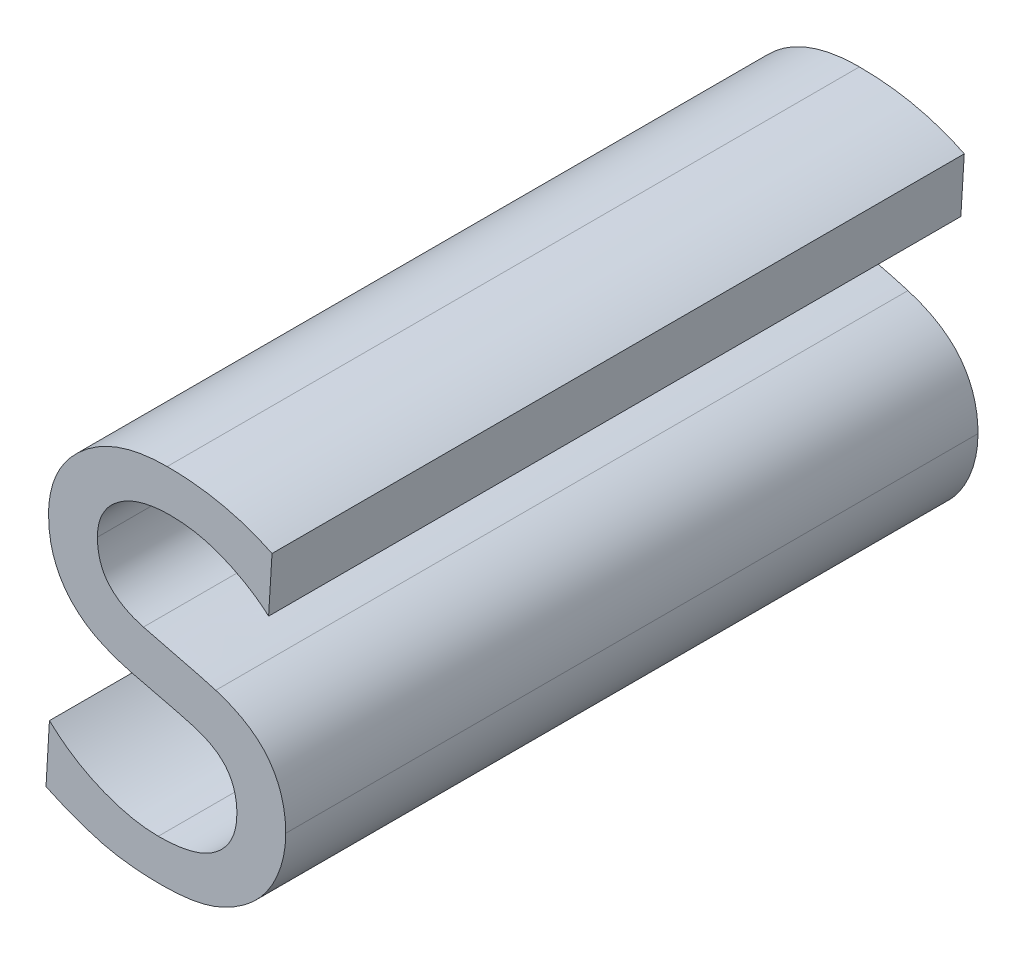
ISO-10303-21;
HEADER;
FILE_DESCRIPTION(('STEP AP214'),'2;1');
FILE_NAME('part.step','',(''),(''),'','','');
FILE_SCHEMA(('AUTOMOTIVE_DESIGN { 1 0 10303 214 1 1 1 1 }'));
ENDSEC;
DATA;
#1=APPLICATION_CONTEXT('core data for automotive mechanical design processes');
#2=APPLICATION_PROTOCOL_DEFINITION('international standard','automotive_design',2000,#1);
#3=PRODUCT_CONTEXT('',#1,'mechanical');
#4=PRODUCT('Part','Part','',(#3));
#5=PRODUCT_RELATED_PRODUCT_CATEGORY('part','',(#4));
#6=PRODUCT_DEFINITION_FORMATION('','',#4);
#7=PRODUCT_DEFINITION_CONTEXT('part definition',#1,'design');
#8=PRODUCT_DEFINITION('design','',#6,#7);
#9=PRODUCT_DEFINITION_SHAPE('','',#8);
#10=(LENGTH_UNIT() NAMED_UNIT(*) SI_UNIT(.MILLI.,.METRE.));
#11=(NAMED_UNIT(*) PLANE_ANGLE_UNIT() SI_UNIT($,.RADIAN.));
#12=(NAMED_UNIT(*) SI_UNIT($,.STERADIAN.) SOLID_ANGLE_UNIT());
#13=UNCERTAINTY_MEASURE_WITH_UNIT(LENGTH_MEASURE(1.E-05),#10,'distance_accuracy_value','');
#14=(GEOMETRIC_REPRESENTATION_CONTEXT(3) GLOBAL_UNCERTAINTY_ASSIGNED_CONTEXT((#13)) GLOBAL_UNIT_ASSIGNED_CONTEXT((#10,
#11,#12)) REPRESENTATION_CONTEXT('',''));
#15=CARTESIAN_POINT('',(0.,0.,0.));
#16=DIRECTION('',(0.,0.,1.));
#17=DIRECTION('',(1.,0.,0.));
#18=AXIS2_PLACEMENT_3D('',#15,#16,#17);
#19=CARTESIAN_POINT('',(-2.185170735583,-1.894329391426,0.));
#20=DIRECTION('',(-1.,0.,0.));
#21=DIRECTION('',(0.,-1.,0.));
#22=AXIS2_PLACEMENT_3D('',#19,#20,#21);
#23=PLANE('',#22);
#24=DIRECTION('',(0.,1.,0.));
#25=VECTOR('',#24,1.);
#26=CARTESIAN_POINT('',(-2.185170735583,-1.902832400857,0.));
#27=LINE('',#26,#25);
#28=CARTESIAN_POINT('',(-2.185170735583,-1.902832400857,0.));
#29=VERTEX_POINT('',#28);
#30=CARTESIAN_POINT('',(-2.184675414645,-1.894329391426,0.));
#31=VERTEX_POINT('',#30);
#32=EDGE_CURVE('E11',#29,#31,#27,.T.);
#33=ORIENTED_EDGE('',*,*,#32,.F.);
#34=DIRECTION('',(0.,0.,1.));
#35=VECTOR('',#34,1.);
#36=CARTESIAN_POINT('',(-2.185170735583,-1.902832400857,0.));
#37=LINE('',#36,#35);
#38=CARTESIAN_POINT('',(-2.185170735583,-1.902832400857,0.1));
#39=VERTEX_POINT('',#38);
#40=EDGE_CURVE('E25',#29,#39,#37,.T.);
#41=ORIENTED_EDGE('',*,*,#40,.T.);
#42=DIRECTION('',(0.,-1.,0.));
#43=VECTOR('',#42,1.);
#44=CARTESIAN_POINT('',(-2.185170735583,-1.902832400857,0.1));
#45=LINE('',#44,#43);
#46=CARTESIAN_POINT('',(-2.184675414645,-1.894329391426,0.1));
#47=VERTEX_POINT('',#46);
#48=EDGE_CURVE('E162',#47,#39,#45,.T.);
#49=ORIENTED_EDGE('',*,*,#48,.F.);
#50=CARTESIAN_POINT('',(-2.184675414645,-1.894329391426,0.));
#51=CARTESIAN_POINT('',(-2.184675414645,-1.894329391426,0.00416666666666667));
#52=CARTESIAN_POINT('',(-2.184675414645,-1.894329391426,0.00833333333333334));
#53=CARTESIAN_POINT('',(-2.184675414645,-1.894329391426,0.0166666666666667));
#54=CARTESIAN_POINT('',(-2.184675414645,-1.894329391426,0.0208333333333333));
#55=CARTESIAN_POINT('',(-2.184675414645,-1.894329391426,0.0291666666666667));
#56=CARTESIAN_POINT('',(-2.184675414645,-1.894329391426,0.0333333333333333));
#57=CARTESIAN_POINT('',(-2.184675414645,-1.894329391426,0.0416666666666667));
#58=CARTESIAN_POINT('',(-2.184675414645,-1.894329391426,0.0458333333333333));
#59=CARTESIAN_POINT('',(-2.184675414645,-1.894329391426,0.0541666666666667));
#60=CARTESIAN_POINT('',(-2.184675414645,-1.894329391426,0.0583333333333333));
#61=CARTESIAN_POINT('',(-2.184675414645,-1.894329391426,0.0666666666666667));
#62=CARTESIAN_POINT('',(-2.184675414645,-1.894329391426,0.0708333333333333));
#63=CARTESIAN_POINT('',(-2.184675414645,-1.894329391426,0.0791666666666667));
#64=CARTESIAN_POINT('',(-2.184675414645,-1.894329391426,0.0833333333333333));
#65=CARTESIAN_POINT('',(-2.184675414645,-1.894329391426,0.0916666666666667));
#66=CARTESIAN_POINT('',(-2.184675414645,-1.894329391426,0.0958333333333333));
#67=CARTESIAN_POINT('',(-2.184675414645,-1.894329391426,0.1));
#68=B_SPLINE_CURVE_WITH_KNOTS('',3,(#50,#51,#52,#53,#54,#55,#56,#57,#58,#59,#60,#61,#62,#63,#64,
#65,#66,#67),.UNSPECIFIED.,.F.,.F.,(4,2,2,2,2,2,2,2,4),(0.,0.0125,0.025,0.0375,0.05,0.0625,
0.075,0.0875,0.1),.UNSPECIFIED.);
#69=EDGE_CURVE('E420',#31,#47,#68,.T.);
#70=ORIENTED_EDGE('',*,*,#69,.F.);
#71=EDGE_LOOP('',(#33,#41,#49,#70));
#72=FACE_BOUND('',#71,.T.);
#73=ADVANCED_FACE('F17',(#72),#23,.T.);
#74=CARTESIAN_POINT('',(-2.168948974873,-1.900933670596,0.));
#75=CARTESIAN_POINT('',(-2.168948974873,-1.900933670596,0.1));
#76=CARTESIAN_POINT('',(-2.17287026563,-1.900933670596,0.));
#77=CARTESIAN_POINT('',(-2.17287026563,-1.900933670596,0.1));
#78=CARTESIAN_POINT('',(-2.181331998316,-1.897466424032,0.));
#79=CARTESIAN_POINT('',(-2.181331998316,-1.897466424032,0.1));
#80=CARTESIAN_POINT('',(-2.184675414645,-1.894329391426,0.));
#81=CARTESIAN_POINT('',(-2.184675414645,-1.894329391426,0.1));
#82=B_SPLINE_SURFACE_WITH_KNOTS('',2,1,((#74,#75),(#76,#77),(#78,#79),(#80,#81)),.UNSPECIFIED.,
.F.,.F.,.F.,(3,1,3),(2,2),(-2.,-1.,0.),(0.,0.01),.UNSPECIFIED.);
#83=CARTESIAN_POINT('',(-2.184675414645,-1.894329391426,0.));
#84=CARTESIAN_POINT('',(-2.181331998316,-1.897466424032,0.));
#85=CARTESIAN_POINT('',(-2.17287026563,-1.900933670596,0.));
#86=CARTESIAN_POINT('',(-2.168948974873,-1.900933670596,0.));
#87=B_SPLINE_CURVE_WITH_KNOTS('',2,(#83,#84,#85,#86),.UNSPECIFIED.,.F.,.F.,(3,1,3),(0.,1.,2.),.UNSPECIFIED.);
#88=CARTESIAN_POINT('',(-2.168948974873,-1.900933670596,0.));
#89=VERTEX_POINT('',#88);
#90=EDGE_CURVE('E600',#31,#89,#87,.T.);
#91=CARTESIAN_POINT('',(-2.168948974873,-1.900933670596,0.1));
#92=CARTESIAN_POINT('',(-2.17287026563,-1.900933670596,0.1));
#93=CARTESIAN_POINT('',(-2.181331998316,-1.897466424032,0.1));
#94=CARTESIAN_POINT('',(-2.184675414645,-1.894329391426,0.1));
#95=B_SPLINE_CURVE_WITH_KNOTS('',2,(#91,#92,#93,#94),.UNSPECIFIED.,.F.,.F.,(3,1,3),(-2.,-1.,0.),.UNSPECIFIED.);
#96=CARTESIAN_POINT('',(-2.168948974873,-1.900933670596,0.1));
#97=VERTEX_POINT('',#96);
#98=EDGE_CURVE('E591',#97,#47,#95,.T.);
#99=DIRECTION('',(0.,0.,1.));
#100=VECTOR('',#99,1.);
#101=CARTESIAN_POINT('',(-2.168948974873,-1.900933670596,0.));
#102=LINE('',#101,#100);
#103=EDGE_CURVE('E585',#89,#97,#102,.T.);
#104=ORIENTED_EDGE('',*,*,#90,.F.);
#105=ORIENTED_EDGE('',*,*,#69,.T.);
#106=ORIENTED_EDGE('',*,*,#98,.F.);
#107=ORIENTED_EDGE('',*,*,#103,.F.);
#108=EDGE_LOOP('',(#104,#105,#106,#107));
#109=FACE_BOUND('',#108,.T.);
#110=ADVANCED_FACE('F389',(#109),#82,.T.);
#111=CARTESIAN_POINT('',(-2.15759787005,-1.892430661165,0.));
#112=CARTESIAN_POINT('',(-2.15759787005,-1.892430661165,0.1));
#113=CARTESIAN_POINT('',(-2.15759787005,-1.896269398432,0.));
#114=CARTESIAN_POINT('',(-2.15759787005,-1.896269398432,0.1));
#115=CARTESIAN_POINT('',(-2.163335337578,-1.900933670596,0.));
#116=CARTESIAN_POINT('',(-2.163335337578,-1.900933670596,0.1));
#117=CARTESIAN_POINT('',(-2.168948974873,-1.900933670596,0.));
#118=CARTESIAN_POINT('',(-2.168948974873,-1.900933670596,0.1));
#119=B_SPLINE_SURFACE_WITH_KNOTS('',2,1,((#111,#112),(#113,#114),(#115,#116),(#117,#118)),
.UNSPECIFIED.,.F.,.F.,.F.,(3,1,3),(2,2),(-2.,-1.,0.),(0.,0.01),.UNSPECIFIED.);
#120=CARTESIAN_POINT('',(-2.168948974873,-1.900933670596,0.));
#121=CARTESIAN_POINT('',(-2.163335337578,-1.900933670596,0.));
#122=CARTESIAN_POINT('',(-2.15759787005,-1.896269398432,0.));
#123=CARTESIAN_POINT('',(-2.15759787005,-1.892430661165,0.));
#124=B_SPLINE_CURVE_WITH_KNOTS('',2,(#120,#121,#122,#123),.UNSPECIFIED.,.F.,.F.,(3,1,3),(0.,1.,
2.),.UNSPECIFIED.);
#125=CARTESIAN_POINT('',(-2.15759787005,-1.892430661165,0.));
#126=VERTEX_POINT('',#125);
#127=EDGE_CURVE('E578',#89,#126,#124,.T.);
#128=CARTESIAN_POINT('',(-2.15759787005,-1.892430661165,0.1));
#129=CARTESIAN_POINT('',(-2.15759787005,-1.896269398432,0.1));
#130=CARTESIAN_POINT('',(-2.163335337578,-1.900933670596,0.1));
#131=CARTESIAN_POINT('',(-2.168948974873,-1.900933670596,0.1));
#132=B_SPLINE_CURVE_WITH_KNOTS('',2,(#128,#129,#130,#131),.UNSPECIFIED.,.F.,.F.,(3,1,3),(-2.,
-1.,0.),.UNSPECIFIED.);
#133=CARTESIAN_POINT('',(-2.15759787005,-1.892430661165,0.1));
#134=VERTEX_POINT('',#133);
#135=EDGE_CURVE('E573',#134,#97,#132,.T.);
#136=DIRECTION('',(0.,0.,1.));
#137=VECTOR('',#136,1.);
#138=CARTESIAN_POINT('',(-2.15759787005,-1.892430661165,0.));
#139=LINE('',#138,#137);
#140=EDGE_CURVE('E567',#126,#134,#139,.T.);
#141=ORIENTED_EDGE('',*,*,#127,.F.);
#142=ORIENTED_EDGE('',*,*,#103,.T.);
#143=ORIENTED_EDGE('',*,*,#135,.F.);
#144=ORIENTED_EDGE('',*,*,#140,.F.);
#145=EDGE_LOOP('',(#141,#142,#143,#144));
#146=FACE_BOUND('',#145,.T.);
#147=ADVANCED_FACE('F379',(#146),#119,.T.);
#148=CARTESIAN_POINT('',(-2.163871935261,-1.884629356396,0.));
#149=CARTESIAN_POINT('',(-2.163871935261,-1.884629356396,0.1));
#150=CARTESIAN_POINT('',(-2.160611072421,-1.885578721526,0.));
#151=CARTESIAN_POINT('',(-2.160611072421,-1.885578721526,0.1));
#152=CARTESIAN_POINT('',(-2.15759787005,-1.889376182049,0.));
#153=CARTESIAN_POINT('',(-2.15759787005,-1.889376182049,0.1));
#154=CARTESIAN_POINT('',(-2.15759787005,-1.892430661165,0.));
#155=CARTESIAN_POINT('',(-2.15759787005,-1.892430661165,0.1));
#156=B_SPLINE_SURFACE_WITH_KNOTS('',2,1,((#148,#149),(#150,#151),(#152,#153),(#154,#155)),
.UNSPECIFIED.,.F.,.F.,.F.,(3,1,3),(2,2),(-2.,-1.,0.),(0.,0.01),.UNSPECIFIED.);
#157=CARTESIAN_POINT('',(-2.15759787005,-1.892430661165,0.));
#158=CARTESIAN_POINT('',(-2.15759787005,-1.889376182049,0.));
#159=CARTESIAN_POINT('',(-2.160611072421,-1.885578721526,0.));
#160=CARTESIAN_POINT('',(-2.163871935261,-1.884629356396,0.));
#161=B_SPLINE_CURVE_WITH_KNOTS('',2,(#157,#158,#159,#160),.UNSPECIFIED.,.F.,.F.,(3,1,3),(0.,1.,
2.),.UNSPECIFIED.);
#162=CARTESIAN_POINT('',(-2.163871935261,-1.884629356396,0.));
#163=VERTEX_POINT('',#162);
#164=EDGE_CURVE('E560',#126,#163,#161,.T.);
#165=CARTESIAN_POINT('',(-2.163871935261,-1.884629356396,0.1));
#166=CARTESIAN_POINT('',(-2.160611072421,-1.885578721526,0.1));
#167=CARTESIAN_POINT('',(-2.15759787005,-1.889376182049,0.1));
#168=CARTESIAN_POINT('',(-2.15759787005,-1.892430661165,0.1));
#169=B_SPLINE_CURVE_WITH_KNOTS('',2,(#165,#166,#167,#168),.UNSPECIFIED.,.F.,.F.,(3,1,3),(-2.,
-1.,0.),.UNSPECIFIED.);
#170=CARTESIAN_POINT('',(-2.163871935261,-1.884629356396,0.1));
#171=VERTEX_POINT('',#170);
#172=EDGE_CURVE('E555',#171,#134,#169,.T.);
#173=DIRECTION('',(0.,0.,1.));
#174=VECTOR('',#173,1.);
#175=CARTESIAN_POINT('',(-2.163871935261,-1.884629356396,0.));
#176=LINE('',#175,#174);
#177=EDGE_CURVE('E549',#163,#171,#176,.T.);
#178=ORIENTED_EDGE('',*,*,#164,.F.);
#179=ORIENTED_EDGE('',*,*,#140,.T.);
#180=ORIENTED_EDGE('',*,*,#172,.F.);
#181=ORIENTED_EDGE('',*,*,#177,.F.);
#182=EDGE_LOOP('',(#178,#179,#180,#181));
#183=FACE_BOUND('',#182,.T.);
#184=ADVANCED_FACE('F368',(#183),#156,.T.);
#185=CARTESIAN_POINT('',(-2.173076649354,-1.882317858686,0.));
#186=CARTESIAN_POINT('',(-2.173076649354,-1.882317858686,0.1));
#187=CARTESIAN_POINT('',(-2.170146000472,-1.883060840093,0.));
#188=CARTESIAN_POINT('',(-2.170146000472,-1.883060840093,0.1));
#189=CARTESIAN_POINT('',(-2.166224709715,-1.883968928479,0.));
#190=CARTESIAN_POINT('',(-2.166224709715,-1.883968928479,0.1));
#191=CARTESIAN_POINT('',(-2.163871935261,-1.884629356396,0.));
#192=CARTESIAN_POINT('',(-2.163871935261,-1.884629356396,0.1));
#193=B_SPLINE_SURFACE_WITH_KNOTS('',2,1,((#185,#186),(#187,#188),(#189,#190),(#191,#192)),
.UNSPECIFIED.,.F.,.F.,.F.,(3,1,3),(2,2),(-2.,-1.,0.),(0.,0.01),.UNSPECIFIED.);
#194=CARTESIAN_POINT('',(-2.163871935261,-1.884629356396,0.));
#195=CARTESIAN_POINT('',(-2.166224709715,-1.883968928479,0.));
#196=CARTESIAN_POINT('',(-2.170146000472,-1.883060840093,0.));
#197=CARTESIAN_POINT('',(-2.173076649354,-1.882317858686,0.));
#198=B_SPLINE_CURVE_WITH_KNOTS('',2,(#194,#195,#196,#197),.UNSPECIFIED.,.F.,.F.,(3,1,3),(0.,1.,
2.),.UNSPECIFIED.);
#199=CARTESIAN_POINT('',(-2.173076649354,-1.882317858686,0.));
#200=VERTEX_POINT('',#199);
#201=EDGE_CURVE('E542',#163,#200,#198,.T.);
#202=CARTESIAN_POINT('',(-2.173076649354,-1.882317858686,0.1));
#203=CARTESIAN_POINT('',(-2.170146000472,-1.883060840093,0.1));
#204=CARTESIAN_POINT('',(-2.166224709715,-1.883968928479,0.1));
#205=CARTESIAN_POINT('',(-2.163871935261,-1.884629356396,0.1));
#206=B_SPLINE_CURVE_WITH_KNOTS('',2,(#202,#203,#204,#205),.UNSPECIFIED.,.F.,.F.,(3,1,3),(-2.,
-1.,0.),.UNSPECIFIED.);
#207=CARTESIAN_POINT('',(-2.173076649354,-1.882317858686,0.1));
#208=VERTEX_POINT('',#207);
#209=EDGE_CURVE('E537',#208,#171,#206,.T.);
#210=DIRECTION('',(0.,0.,1.));
#211=VECTOR('',#210,1.);
#212=CARTESIAN_POINT('',(-2.173076649354,-1.882317858686,0.));
#213=LINE('',#212,#211);
#214=EDGE_CURVE('E531',#200,#208,#213,.T.);
#215=ORIENTED_EDGE('',*,*,#201,.F.);
#216=ORIENTED_EDGE('',*,*,#177,.T.);
#217=ORIENTED_EDGE('',*,*,#209,.F.);
#218=ORIENTED_EDGE('',*,*,#214,.F.);
#219=EDGE_LOOP('',(#215,#216,#217,#218));
#220=FACE_BOUND('',#219,.T.);
#221=ADVANCED_FACE('F357',(#220),#193,.T.);
#222=CARTESIAN_POINT('',(-2.181497105295,-1.877818693502,0.));
#223=CARTESIAN_POINT('',(-2.181497105295,-1.877818693502,0.1));
#224=CARTESIAN_POINT('',(-2.179887312247,-1.879511040039,0.));
#225=CARTESIAN_POINT('',(-2.179887312247,-1.879511040039,0.1));
#226=CARTESIAN_POINT('',(-2.175718361021,-1.881616154025,0.));
#227=CARTESIAN_POINT('',(-2.175718361021,-1.881616154025,0.1));
#228=CARTESIAN_POINT('',(-2.173076649354,-1.882317858686,0.));
#229=CARTESIAN_POINT('',(-2.173076649354,-1.882317858686,0.1));
#230=B_SPLINE_SURFACE_WITH_KNOTS('',2,1,((#222,#223),(#224,#225),(#226,#227),(#228,#229)),
.UNSPECIFIED.,.F.,.F.,.F.,(3,1,3),(2,2),(-2.,-1.,0.),(0.,0.01),.UNSPECIFIED.);
#231=CARTESIAN_POINT('',(-2.173076649354,-1.882317858686,0.));
#232=CARTESIAN_POINT('',(-2.175718361021,-1.881616154025,0.));
#233=CARTESIAN_POINT('',(-2.179887312247,-1.879511040039,0.));
#234=CARTESIAN_POINT('',(-2.181497105295,-1.877818693502,0.));
#235=B_SPLINE_CURVE_WITH_KNOTS('',2,(#231,#232,#233,#234),.UNSPECIFIED.,.F.,.F.,(3,1,3),(0.,1.,
2.),.UNSPECIFIED.);
#236=CARTESIAN_POINT('',(-2.181497105295,-1.877818693502,0.));
#237=VERTEX_POINT('',#236);
#238=EDGE_CURVE('E524',#200,#237,#235,.T.);
#239=CARTESIAN_POINT('',(-2.181497105295,-1.877818693502,0.1));
#240=CARTESIAN_POINT('',(-2.179887312247,-1.879511040039,0.1));
#241=CARTESIAN_POINT('',(-2.175718361021,-1.881616154025,0.1));
#242=CARTESIAN_POINT('',(-2.173076649354,-1.882317858686,0.1));
#243=B_SPLINE_CURVE_WITH_KNOTS('',2,(#239,#240,#241,#242),.UNSPECIFIED.,.F.,.F.,(3,1,3),(-2.,
-1.,0.),.UNSPECIFIED.);
#244=CARTESIAN_POINT('',(-2.181497105295,-1.877818693502,0.1));
#245=VERTEX_POINT('',#244);
#246=EDGE_CURVE('E519',#245,#208,#243,.T.);
#247=DIRECTION('',(0.,0.,1.));
#248=VECTOR('',#247,1.);
#249=CARTESIAN_POINT('',(-2.181497105295,-1.877818693502,0.));
#250=LINE('',#249,#248);
#251=EDGE_CURVE('E513',#237,#245,#250,.T.);
#252=ORIENTED_EDGE('',*,*,#238,.F.);
#253=ORIENTED_EDGE('',*,*,#214,.T.);
#254=ORIENTED_EDGE('',*,*,#246,.F.);
#255=ORIENTED_EDGE('',*,*,#251,.F.);
#256=EDGE_LOOP('',(#252,#253,#254,#255));
#257=FACE_BOUND('',#256,.T.);
#258=ADVANCED_FACE('F346',(#257),#230,.T.);
#259=CARTESIAN_POINT('',(-2.18479924488,-1.86861397941,0.));
#260=CARTESIAN_POINT('',(-2.18479924488,-1.86861397941,0.1));
#261=CARTESIAN_POINT('',(-2.18479924488,-1.871585905036,0.));
#262=CARTESIAN_POINT('',(-2.18479924488,-1.871585905036,0.1));
#263=CARTESIAN_POINT('',(-2.183065621598,-1.876126346965,0.));
#264=CARTESIAN_POINT('',(-2.183065621598,-1.876126346965,0.1));
#265=CARTESIAN_POINT('',(-2.181497105295,-1.877818693502,0.));
#266=CARTESIAN_POINT('',(-2.181497105295,-1.877818693502,0.1));
#267=B_SPLINE_SURFACE_WITH_KNOTS('',2,1,((#259,#260),(#261,#262),(#263,#264),(#265,#266)),
.UNSPECIFIED.,.F.,.F.,.F.,(3,1,3),(2,2),(-2.,-1.,0.),(0.,0.01),.UNSPECIFIED.);
#268=CARTESIAN_POINT('',(-2.181497105295,-1.877818693502,0.));
#269=CARTESIAN_POINT('',(-2.183065621598,-1.876126346965,0.));
#270=CARTESIAN_POINT('',(-2.18479924488,-1.871585905036,0.));
#271=CARTESIAN_POINT('',(-2.18479924488,-1.86861397941,0.));
#272=B_SPLINE_CURVE_WITH_KNOTS('',2,(#268,#269,#270,#271),.UNSPECIFIED.,.F.,.F.,(3,1,3),(0.,1.,
2.),.UNSPECIFIED.);
#273=CARTESIAN_POINT('',(-2.18479924488,-1.86861397941,0.));
#274=VERTEX_POINT('',#273);
#275=EDGE_CURVE('E506',#237,#274,#272,.T.);
#276=CARTESIAN_POINT('',(-2.18479924488,-1.86861397941,0.1));
#277=CARTESIAN_POINT('',(-2.18479924488,-1.871585905036,0.1));
#278=CARTESIAN_POINT('',(-2.183065621598,-1.876126346965,0.1));
#279=CARTESIAN_POINT('',(-2.181497105295,-1.877818693502,0.1));
#280=B_SPLINE_CURVE_WITH_KNOTS('',2,(#276,#277,#278,#279),.UNSPECIFIED.,.F.,.F.,(3,1,3),(-2.,
-1.,0.),.UNSPECIFIED.);
#281=CARTESIAN_POINT('',(-2.18479924488,-1.86861397941,0.1));
#282=VERTEX_POINT('',#281);
#283=EDGE_CURVE('E501',#282,#245,#280,.T.);
#284=DIRECTION('',(0.,0.,1.));
#285=VECTOR('',#284,1.);
#286=CARTESIAN_POINT('',(-2.18479924488,-1.86861397941,0.));
#287=LINE('',#286,#285);
#288=EDGE_CURVE('E495',#274,#282,#287,.T.);
#289=ORIENTED_EDGE('',*,*,#275,.F.);
#290=ORIENTED_EDGE('',*,*,#251,.T.);
#291=ORIENTED_EDGE('',*,*,#283,.F.);
#292=ORIENTED_EDGE('',*,*,#288,.F.);
#293=EDGE_LOOP('',(#289,#290,#291,#292));
#294=FACE_BOUND('',#293,.T.);
#295=ADVANCED_FACE('F335',(#294),#267,.T.);
#296=CARTESIAN_POINT('',(-2.167669395783,-1.854043288492,0.));
#297=CARTESIAN_POINT('',(-2.167669395783,-1.854043288492,0.1));
#298=CARTESIAN_POINT('',(-2.175140486594,-1.854043288492,0.));
#299=CARTESIAN_POINT('',(-2.175140486594,-1.854043288492,0.1));
#300=CARTESIAN_POINT('',(-2.18479924488,-1.862422467688,0.));
#301=CARTESIAN_POINT('',(-2.18479924488,-1.862422467688,0.1));
#302=CARTESIAN_POINT('',(-2.18479924488,-1.86861397941,0.));
#303=CARTESIAN_POINT('',(-2.18479924488,-1.86861397941,0.1));
#304=B_SPLINE_SURFACE_WITH_KNOTS('',2,1,((#296,#297),(#298,#299),(#300,#301),(#302,#303)),
.UNSPECIFIED.,.F.,.F.,.F.,(3,1,3),(2,2),(-2.,-1.,0.),(0.,0.01),.UNSPECIFIED.);
#305=CARTESIAN_POINT('',(-2.18479924488,-1.86861397941,0.));
#306=CARTESIAN_POINT('',(-2.18479924488,-1.862422467688,0.));
#307=CARTESIAN_POINT('',(-2.175140486594,-1.854043288492,0.));
#308=CARTESIAN_POINT('',(-2.167669395783,-1.854043288492,0.));
#309=B_SPLINE_CURVE_WITH_KNOTS('',2,(#305,#306,#307,#308),.UNSPECIFIED.,.F.,.F.,(3,1,3),(0.,1.,
2.),.UNSPECIFIED.);
#310=CARTESIAN_POINT('',(-2.167669395783,-1.854043288492,0.));
#311=VERTEX_POINT('',#310);
#312=EDGE_CURVE('E488',#274,#311,#309,.T.);
#313=CARTESIAN_POINT('',(-2.167669395783,-1.854043288492,0.1));
#314=CARTESIAN_POINT('',(-2.175140486594,-1.854043288492,0.1));
#315=CARTESIAN_POINT('',(-2.18479924488,-1.862422467688,0.1));
#316=CARTESIAN_POINT('',(-2.18479924488,-1.86861397941,0.1));
#317=B_SPLINE_CURVE_WITH_KNOTS('',2,(#313,#314,#315,#316),.UNSPECIFIED.,.F.,.F.,(3,1,3),(-2.,
-1.,0.),.UNSPECIFIED.);
#318=CARTESIAN_POINT('',(-2.167669395783,-1.854043288492,0.1));
#319=VERTEX_POINT('',#318);
#320=EDGE_CURVE('E483',#319,#282,#317,.T.);
#321=DIRECTION('',(0.,0.,1.));
#322=VECTOR('',#321,1.);
#323=CARTESIAN_POINT('',(-2.167669395783,-1.854043288492,0.));
#324=LINE('',#323,#322);
#325=EDGE_CURVE('E477',#311,#319,#324,.T.);
#326=ORIENTED_EDGE('',*,*,#312,.F.);
#327=ORIENTED_EDGE('',*,*,#288,.T.);
#328=ORIENTED_EDGE('',*,*,#320,.F.);
#329=ORIENTED_EDGE('',*,*,#325,.F.);
#330=EDGE_LOOP('',(#326,#327,#328,#329));
#331=FACE_BOUND('',#330,.T.);
#332=ADVANCED_FACE('F324',(#331),#304,.T.);
#333=CARTESIAN_POINT('',(-2.152520830438,-1.857345428076,0.));
#334=CARTESIAN_POINT('',(-2.152520830438,-1.857345428076,0.1));
#335=CARTESIAN_POINT('',(-2.155781693278,-1.855735635029,0.));
#336=CARTESIAN_POINT('',(-2.155781693278,-1.855735635029,0.1));
#337=CARTESIAN_POINT('',(-2.163376614323,-1.854043288492,0.));
#338=CARTESIAN_POINT('',(-2.163376614323,-1.854043288492,0.1));
#339=CARTESIAN_POINT('',(-2.167669395783,-1.854043288492,0.));
#340=CARTESIAN_POINT('',(-2.167669395783,-1.854043288492,0.1));
#341=B_SPLINE_SURFACE_WITH_KNOTS('',2,1,((#333,#334),(#335,#336),(#337,#338),(#339,#340)),
.UNSPECIFIED.,.F.,.F.,.F.,(3,1,3),(2,2),(-2.,-1.,0.),(0.,0.01),.UNSPECIFIED.);
#342=CARTESIAN_POINT('',(-2.167669395783,-1.854043288492,0.));
#343=CARTESIAN_POINT('',(-2.163376614323,-1.854043288492,0.));
#344=CARTESIAN_POINT('',(-2.155781693278,-1.855735635029,0.));
#345=CARTESIAN_POINT('',(-2.152520830438,-1.857345428076,0.));
#346=B_SPLINE_CURVE_WITH_KNOTS('',2,(#342,#343,#344,#345),.UNSPECIFIED.,.F.,.F.,(3,1,3),(0.,1.,
2.),.UNSPECIFIED.);
#347=CARTESIAN_POINT('',(-2.152520830438,-1.857345428076,0.));
#348=VERTEX_POINT('',#347);
#349=EDGE_CURVE('E470',#311,#348,#346,.T.);
#350=CARTESIAN_POINT('',(-2.152520830438,-1.857345428076,0.1));
#351=CARTESIAN_POINT('',(-2.155781693278,-1.855735635029,0.1));
#352=CARTESIAN_POINT('',(-2.163376614323,-1.854043288492,0.1));
#353=CARTESIAN_POINT('',(-2.167669395783,-1.854043288492,0.1));
#354=B_SPLINE_CURVE_WITH_KNOTS('',2,(#350,#351,#352,#353),.UNSPECIFIED.,.F.,.F.,(3,1,3),(-2.,
-1.,0.),.UNSPECIFIED.);
#355=CARTESIAN_POINT('',(-2.152520830438,-1.857345428076,0.1));
#356=VERTEX_POINT('',#355);
#357=EDGE_CURVE('E465',#356,#319,#354,.T.);
#358=DIRECTION('',(0.,0.,1.));
#359=VECTOR('',#358,1.);
#360=CARTESIAN_POINT('',(-2.152520830438,-1.857345428076,0.));
#361=LINE('',#360,#359);
#362=EDGE_CURVE('E462',#348,#356,#361,.T.);
#363=ORIENTED_EDGE('',*,*,#349,.F.);
#364=ORIENTED_EDGE('',*,*,#325,.T.);
#365=ORIENTED_EDGE('',*,*,#357,.F.);
#366=ORIENTED_EDGE('',*,*,#362,.F.);
#367=EDGE_LOOP('',(#363,#364,#365,#366));
#368=FACE_BOUND('',#367,.T.);
#369=ADVANCED_FACE('F314',(#368),#341,.T.);
#370=CARTESIAN_POINT('',(-2.152520830438,-1.865435670059,0.));
#371=DIRECTION('',(1.,0.,0.));
#372=DIRECTION('',(0.,1.,0.));
#373=AXIS2_PLACEMENT_3D('',#370,#371,#372);
#374=PLANE('',#373);
#375=DIRECTION('',(0.,-1.,0.));
#376=VECTOR('',#375,1.);
#377=CARTESIAN_POINT('',(-2.152520830438,-1.857345428076,0.));
#378=LINE('',#377,#376);
#379=CARTESIAN_POINT('',(-2.153016151376,-1.865435670059,0.));
#380=VERTEX_POINT('',#379);
#381=EDGE_CURVE('E458',#348,#380,#378,.T.);
#382=ORIENTED_EDGE('',*,*,#381,.F.);
#383=ORIENTED_EDGE('',*,*,#362,.T.);
#384=DIRECTION('',(0.,1.,0.));
#385=VECTOR('',#384,1.);
#386=CARTESIAN_POINT('',(-2.152520830438,-1.857345428076,0.1));
#387=LINE('',#386,#385);
#388=CARTESIAN_POINT('',(-2.153016151376,-1.865435670059,0.1));
#389=VERTEX_POINT('',#388);
#390=EDGE_CURVE('E451',#389,#356,#387,.T.);
#391=ORIENTED_EDGE('',*,*,#390,.F.);
#392=CARTESIAN_POINT('',(-2.153016151376,-1.865435670059,0.));
#393=CARTESIAN_POINT('',(-2.153016151376,-1.865435670059,0.00416666666666667));
#394=CARTESIAN_POINT('',(-2.153016151376,-1.865435670059,0.00833333333333334));
#395=CARTESIAN_POINT('',(-2.153016151376,-1.865435670059,0.0166666666666667));
#396=CARTESIAN_POINT('',(-2.153016151376,-1.865435670059,0.0208333333333333));
#397=CARTESIAN_POINT('',(-2.153016151376,-1.865435670059,0.0291666666666667));
#398=CARTESIAN_POINT('',(-2.153016151376,-1.865435670059,0.0333333333333333));
#399=CARTESIAN_POINT('',(-2.153016151376,-1.865435670059,0.0416666666666667));
#400=CARTESIAN_POINT('',(-2.153016151376,-1.865435670059,0.0458333333333333));
#401=CARTESIAN_POINT('',(-2.153016151376,-1.865435670059,0.0541666666666667));
#402=CARTESIAN_POINT('',(-2.153016151376,-1.865435670059,0.0583333333333333));
#403=CARTESIAN_POINT('',(-2.153016151376,-1.865435670059,0.0666666666666667));
#404=CARTESIAN_POINT('',(-2.153016151376,-1.865435670059,0.0708333333333333));
#405=CARTESIAN_POINT('',(-2.153016151376,-1.865435670059,0.0791666666666667));
#406=CARTESIAN_POINT('',(-2.153016151376,-1.865435670059,0.0833333333333333));
#407=CARTESIAN_POINT('',(-2.153016151376,-1.865435670059,0.0916666666666667));
#408=CARTESIAN_POINT('',(-2.153016151376,-1.865435670059,0.0958333333333333));
#409=CARTESIAN_POINT('',(-2.153016151376,-1.865435670059,0.1));
#410=B_SPLINE_CURVE_WITH_KNOTS('',3,(#392,#393,#394,#395,#396,#397,#398,#399,#400,#401,#402,
#403,#404,#405,#406,#407,#408,#409),.UNSPECIFIED.,.F.,.F.,(4,2,2,2,2,2,2,2,4),(0.,0.0125,0.025,
0.0375,0.05,0.0625,0.075,0.0875,0.1),.UNSPECIFIED.);
#411=EDGE_CURVE('E296',#380,#389,#410,.T.);
#412=ORIENTED_EDGE('',*,*,#411,.F.);
#413=EDGE_LOOP('',(#382,#383,#391,#412));
#414=FACE_BOUND('',#413,.T.);
#415=ADVANCED_FACE('F303',(#414),#374,.T.);
#416=CARTESIAN_POINT('',(-2.167215351591,-1.859904586255,0.));
#417=CARTESIAN_POINT('',(-2.167215351591,-1.859904586255,0.1));
#418=CARTESIAN_POINT('',(-2.163046400365,-1.859904586255,0.));
#419=CARTESIAN_POINT('',(-2.163046400365,-1.859904586255,0.1));
#420=CARTESIAN_POINT('',(-2.15545147932,-1.863206725839,0.));
#421=CARTESIAN_POINT('',(-2.15545147932,-1.863206725839,0.1));
#422=CARTESIAN_POINT('',(-2.153016151376,-1.865435670059,0.));
#423=CARTESIAN_POINT('',(-2.153016151376,-1.865435670059,0.1));
#424=B_SPLINE_SURFACE_WITH_KNOTS('',2,1,((#416,#417),(#418,#419),(#420,#421),(#422,#423)),
.UNSPECIFIED.,.F.,.F.,.F.,(3,1,3),(2,2),(-2.,-1.,0.),(0.,0.01),.UNSPECIFIED.);
#425=CARTESIAN_POINT('',(-2.153016151376,-1.865435670059,0.));
#426=CARTESIAN_POINT('',(-2.15545147932,-1.863206725839,0.));
#427=CARTESIAN_POINT('',(-2.163046400365,-1.859904586255,0.));
#428=CARTESIAN_POINT('',(-2.167215351591,-1.859904586255,0.));
#429=B_SPLINE_CURVE_WITH_KNOTS('',2,(#425,#426,#427,#428),.UNSPECIFIED.,.F.,.F.,(3,1,3),(0.,1.,
2.),.UNSPECIFIED.);
#430=CARTESIAN_POINT('',(-2.167215351591,-1.859904586255,0.));
#431=VERTEX_POINT('',#430);
#432=EDGE_CURVE('E287',#380,#431,#429,.T.);
#433=CARTESIAN_POINT('',(-2.167215351591,-1.859904586255,0.1));
#434=CARTESIAN_POINT('',(-2.163046400365,-1.859904586255,0.1));
#435=CARTESIAN_POINT('',(-2.15545147932,-1.863206725839,0.1));
#436=CARTESIAN_POINT('',(-2.153016151376,-1.865435670059,0.1));
#437=B_SPLINE_CURVE_WITH_KNOTS('',2,(#433,#434,#435,#436),.UNSPECIFIED.,.F.,.F.,(3,1,3),(-2.,
-1.,0.),.UNSPECIFIED.);
#438=CARTESIAN_POINT('',(-2.167215351591,-1.859904586255,0.1));
#439=VERTEX_POINT('',#438);
#440=EDGE_CURVE('E277',#439,#389,#437,.T.);
#441=DIRECTION('',(0.,0.,1.));
#442=VECTOR('',#441,1.);
#443=CARTESIAN_POINT('',(-2.167215351591,-1.859904586255,0.));
#444=LINE('',#443,#442);
#445=EDGE_CURVE('E271',#431,#439,#444,.T.);
#446=ORIENTED_EDGE('',*,*,#432,.F.);
#447=ORIENTED_EDGE('',*,*,#411,.T.);
#448=ORIENTED_EDGE('',*,*,#440,.F.);
#449=ORIENTED_EDGE('',*,*,#445,.F.);
#450=EDGE_LOOP('',(#446,#447,#448,#449));
#451=FACE_BOUND('',#450,.T.);
#452=ADVANCED_FACE('F313',(#451),#424,.T.);
#453=CARTESIAN_POINT('',(-2.177740921517,-1.867912274748,0.));
#454=CARTESIAN_POINT('',(-2.177740921517,-1.867912274748,0.1));
#455=CARTESIAN_POINT('',(-2.177740921517,-1.864321197949,0.));
#456=CARTESIAN_POINT('',(-2.177740921517,-1.864321197949,0.1));
#457=CARTESIAN_POINT('',(-2.171920900499,-1.859904586255,0.));
#458=CARTESIAN_POINT('',(-2.171920900499,-1.859904586255,0.1));
#459=CARTESIAN_POINT('',(-2.167215351591,-1.859904586255,0.));
#460=CARTESIAN_POINT('',(-2.167215351591,-1.859904586255,0.1));
#461=B_SPLINE_SURFACE_WITH_KNOTS('',2,1,((#453,#454),(#455,#456),(#457,#458),(#459,#460)),
.UNSPECIFIED.,.F.,.F.,.F.,(3,1,3),(2,2),(-2.,-1.,0.),(0.,0.01),.UNSPECIFIED.);
#462=CARTESIAN_POINT('',(-2.167215351591,-1.859904586255,0.));
#463=CARTESIAN_POINT('',(-2.171920900499,-1.859904586255,0.));
#464=CARTESIAN_POINT('',(-2.177740921517,-1.864321197949,0.));
#465=CARTESIAN_POINT('',(-2.177740921517,-1.867912274748,0.));
#466=B_SPLINE_CURVE_WITH_KNOTS('',2,(#462,#463,#464,#465),.UNSPECIFIED.,.F.,.F.,(3,1,3),(0.,1.,
2.),.UNSPECIFIED.);
#467=CARTESIAN_POINT('',(-2.177740921517,-1.867912274748,0.));
#468=VERTEX_POINT('',#467);
#469=EDGE_CURVE('E264',#431,#468,#466,.T.);
#470=CARTESIAN_POINT('',(-2.177740921517,-1.867912274748,0.1));
#471=CARTESIAN_POINT('',(-2.177740921517,-1.864321197949,0.1));
#472=CARTESIAN_POINT('',(-2.171920900499,-1.859904586255,0.1));
#473=CARTESIAN_POINT('',(-2.167215351591,-1.859904586255,0.1));
#474=B_SPLINE_CURVE_WITH_KNOTS('',2,(#470,#471,#472,#473),.UNSPECIFIED.,.F.,.F.,(3,1,3),(-2.,
-1.,0.),.UNSPECIFIED.);
#475=CARTESIAN_POINT('',(-2.177740921517,-1.867912274748,0.1));
#476=VERTEX_POINT('',#475);
#477=EDGE_CURVE('E259',#476,#439,#474,.T.);
#478=DIRECTION('',(0.,0.,1.));
#479=VECTOR('',#478,1.);
#480=CARTESIAN_POINT('',(-2.177740921517,-1.867912274748,0.));
#481=LINE('',#480,#479);
#482=EDGE_CURVE('E253',#468,#476,#481,.T.);
#483=ORIENTED_EDGE('',*,*,#469,.F.);
#484=ORIENTED_EDGE('',*,*,#445,.T.);
#485=ORIENTED_EDGE('',*,*,#477,.F.);
#486=ORIENTED_EDGE('',*,*,#482,.F.);
#487=EDGE_LOOP('',(#483,#484,#485,#486));
#488=FACE_BOUND('',#487,.T.);
#489=ADVANCED_FACE('F444',(#488),#461,.T.);
#490=CARTESIAN_POINT('',(-2.171095365603,-1.875837409751,0.));
#491=CARTESIAN_POINT('',(-2.171095365603,-1.875837409751,0.1));
#492=CARTESIAN_POINT('',(-2.174314951698,-1.87497059811,0.));
#493=CARTESIAN_POINT('',(-2.174314951698,-1.87497059811,0.1));
#494=CARTESIAN_POINT('',(-2.177740921517,-1.871131860843,0.));
#495=CARTESIAN_POINT('',(-2.177740921517,-1.871131860843,0.1));
#496=CARTESIAN_POINT('',(-2.177740921517,-1.867912274748,0.));
#497=CARTESIAN_POINT('',(-2.177740921517,-1.867912274748,0.1));
#498=B_SPLINE_SURFACE_WITH_KNOTS('',2,1,((#490,#491),(#492,#493),(#494,#495),(#496,#497)),
.UNSPECIFIED.,.F.,.F.,.F.,(3,1,3),(2,2),(-2.,-1.,0.),(0.,0.01),.UNSPECIFIED.);
#499=CARTESIAN_POINT('',(-2.177740921517,-1.867912274748,0.));
#500=CARTESIAN_POINT('',(-2.177740921517,-1.871131860843,0.));
#501=CARTESIAN_POINT('',(-2.174314951698,-1.87497059811,0.));
#502=CARTESIAN_POINT('',(-2.171095365603,-1.875837409751,0.));
#503=B_SPLINE_CURVE_WITH_KNOTS('',2,(#499,#500,#501,#502),.UNSPECIFIED.,.F.,.F.,(3,1,3),(0.,1.,
2.),.UNSPECIFIED.);
#504=CARTESIAN_POINT('',(-2.171095365603,-1.875837409751,0.));
#505=VERTEX_POINT('',#504);
#506=EDGE_CURVE('E246',#468,#505,#503,.T.);
#507=CARTESIAN_POINT('',(-2.171095365603,-1.875837409751,0.1));
#508=CARTESIAN_POINT('',(-2.174314951698,-1.87497059811,0.1));
#509=CARTESIAN_POINT('',(-2.177740921517,-1.871131860843,0.1));
#510=CARTESIAN_POINT('',(-2.177740921517,-1.867912274748,0.1));
#511=B_SPLINE_CURVE_WITH_KNOTS('',2,(#507,#508,#509,#510),.UNSPECIFIED.,.F.,.F.,(3,1,3),(-2.,
-1.,0.),.UNSPECIFIED.);
#512=CARTESIAN_POINT('',(-2.171095365603,-1.875837409751,0.1));
#513=VERTEX_POINT('',#512);
#514=EDGE_CURVE('E241',#513,#476,#511,.T.);
#515=DIRECTION('',(0.,0.,1.));
#516=VECTOR('',#515,1.);
#517=CARTESIAN_POINT('',(-2.171095365603,-1.875837409751,0.));
#518=LINE('',#517,#516);
#519=EDGE_CURVE('E235',#505,#513,#518,.T.);
#520=ORIENTED_EDGE('',*,*,#506,.F.);
#521=ORIENTED_EDGE('',*,*,#482,.T.);
#522=ORIENTED_EDGE('',*,*,#514,.F.);
#523=ORIENTED_EDGE('',*,*,#519,.F.);
#524=EDGE_LOOP('',(#520,#521,#522,#523));
#525=FACE_BOUND('',#524,.T.);
#526=ADVANCED_FACE('F440',(#525),#498,.T.);
#527=CARTESIAN_POINT('',(-2.160652349166,-1.878520398164,0.));
#528=CARTESIAN_POINT('',(-2.160652349166,-1.878520398164,0.1));
#529=CARTESIAN_POINT('',(-2.162716186406,-1.877901246992,0.));
#530=CARTESIAN_POINT('',(-2.162716186406,-1.877901246992,0.1));
#531=CARTESIAN_POINT('',(-2.168948974873,-1.876415284179,0.));
#532=CARTESIAN_POINT('',(-2.168948974873,-1.876415284179,0.1));
#533=CARTESIAN_POINT('',(-2.171095365603,-1.875837409751,0.));
#534=CARTESIAN_POINT('',(-2.171095365603,-1.875837409751,0.1));
#535=B_SPLINE_SURFACE_WITH_KNOTS('',2,1,((#527,#528),(#529,#530),(#531,#532),(#533,#534)),
.UNSPECIFIED.,.F.,.F.,.F.,(3,1,3),(2,2),(-2.,-1.,0.),(0.,0.01),.UNSPECIFIED.);
#536=CARTESIAN_POINT('',(-2.171095365603,-1.875837409751,0.));
#537=CARTESIAN_POINT('',(-2.168948974873,-1.876415284179,0.));
#538=CARTESIAN_POINT('',(-2.162716186406,-1.877901246992,0.));
#539=CARTESIAN_POINT('',(-2.160652349166,-1.878520398164,0.));
#540=B_SPLINE_CURVE_WITH_KNOTS('',2,(#536,#537,#538,#539),.UNSPECIFIED.,.F.,.F.,(3,1,3),(0.,1.,
2.),.UNSPECIFIED.);
#541=CARTESIAN_POINT('',(-2.160652349166,-1.878520398164,0.));
#542=VERTEX_POINT('',#541);
#543=EDGE_CURVE('E228',#505,#542,#540,.T.);
#544=CARTESIAN_POINT('',(-2.160652349166,-1.878520398164,0.1));
#545=CARTESIAN_POINT('',(-2.162716186406,-1.877901246992,0.1));
#546=CARTESIAN_POINT('',(-2.168948974873,-1.876415284179,0.1));
#547=CARTESIAN_POINT('',(-2.171095365603,-1.875837409751,0.1));
#548=B_SPLINE_CURVE_WITH_KNOTS('',2,(#544,#545,#546,#547),.UNSPECIFIED.,.F.,.F.,(3,1,3),(-2.,
-1.,0.),.UNSPECIFIED.);
#549=CARTESIAN_POINT('',(-2.160652349166,-1.878520398164,0.1));
#550=VERTEX_POINT('',#549);
#551=EDGE_CURVE('E223',#550,#513,#548,.T.);
#552=DIRECTION('',(0.,0.,1.));
#553=VECTOR('',#552,1.);
#554=CARTESIAN_POINT('',(-2.160652349166,-1.878520398164,0.));
#555=LINE('',#554,#553);
#556=EDGE_CURVE('E217',#542,#550,#555,.T.);
#557=ORIENTED_EDGE('',*,*,#543,.F.);
#558=ORIENTED_EDGE('',*,*,#519,.T.);
#559=ORIENTED_EDGE('',*,*,#551,.F.);
#560=ORIENTED_EDGE('',*,*,#556,.F.);
#561=EDGE_LOOP('',(#557,#558,#559,#560));
#562=FACE_BOUND('',#561,.T.);
#563=ADVANCED_FACE('F436',(#562),#535,.T.);
#564=CARTESIAN_POINT('',(-2.150539546687,-1.8913574658,0.));
#565=CARTESIAN_POINT('',(-2.150539546687,-1.8913574658,0.1));
#566=CARTESIAN_POINT('',(-2.150539546687,-1.886610640147,0.));
#567=CARTESIAN_POINT('',(-2.150539546687,-1.886610640147,0.1));
#568=CARTESIAN_POINT('',(-2.155410202575,-1.880130191211,0.));
#569=CARTESIAN_POINT('',(-2.155410202575,-1.880130191211,0.1));
#570=CARTESIAN_POINT('',(-2.160652349166,-1.878520398164,0.));
#571=CARTESIAN_POINT('',(-2.160652349166,-1.878520398164,0.1));
#572=B_SPLINE_SURFACE_WITH_KNOTS('',2,1,((#564,#565),(#566,#567),(#568,#569),(#570,#571)),
.UNSPECIFIED.,.F.,.F.,.F.,(3,1,3),(2,2),(-2.,-1.,0.),(0.,0.01),.UNSPECIFIED.);
#573=CARTESIAN_POINT('',(-2.160652349166,-1.878520398164,0.));
#574=CARTESIAN_POINT('',(-2.155410202575,-1.880130191211,0.));
#575=CARTESIAN_POINT('',(-2.150539546687,-1.886610640147,0.));
#576=CARTESIAN_POINT('',(-2.150539546687,-1.8913574658,0.));
#577=B_SPLINE_CURVE_WITH_KNOTS('',2,(#573,#574,#575,#576),.UNSPECIFIED.,.F.,.F.,(3,1,3),(0.,1.,
2.),.UNSPECIFIED.);
#578=CARTESIAN_POINT('',(-2.150539546687,-1.8913574658,0.));
#579=VERTEX_POINT('',#578);
#580=EDGE_CURVE('E210',#542,#579,#577,.T.);
#581=CARTESIAN_POINT('',(-2.150539546687,-1.8913574658,0.1));
#582=CARTESIAN_POINT('',(-2.150539546687,-1.886610640147,0.1));
#583=CARTESIAN_POINT('',(-2.155410202575,-1.880130191211,0.1));
#584=CARTESIAN_POINT('',(-2.160652349166,-1.878520398164,0.1));
#585=B_SPLINE_CURVE_WITH_KNOTS('',2,(#581,#582,#583,#584),.UNSPECIFIED.,.F.,.F.,(3,1,3),(-2.,
-1.,0.),.UNSPECIFIED.);
#586=CARTESIAN_POINT('',(-2.150539546687,-1.8913574658,0.1));
#587=VERTEX_POINT('',#586);
#588=EDGE_CURVE('E205',#587,#550,#585,.T.);
#589=DIRECTION('',(0.,0.,1.));
#590=VECTOR('',#589,1.);
#591=CARTESIAN_POINT('',(-2.150539546687,-1.8913574658,0.));
#592=LINE('',#591,#590);
#593=EDGE_CURVE('E199',#579,#587,#592,.T.);
#594=ORIENTED_EDGE('',*,*,#580,.F.);
#595=ORIENTED_EDGE('',*,*,#556,.T.);
#596=ORIENTED_EDGE('',*,*,#588,.F.);
#597=ORIENTED_EDGE('',*,*,#593,.F.);
#598=EDGE_LOOP('',(#594,#595,#596,#597));
#599=FACE_BOUND('',#598,.T.);
#600=ADVANCED_FACE('F432',(#599),#572,.T.);
#601=CARTESIAN_POINT('',(-2.155162542106,-1.90217197294,0.));
#602=CARTESIAN_POINT('',(-2.155162542106,-1.90217197294,0.1));
#603=CARTESIAN_POINT('',(-2.152974874631,-1.900149412444,0.));
#604=CARTESIAN_POINT('',(-2.152974874631,-1.900149412444,0.1));
#605=CARTESIAN_POINT('',(-2.150539546687,-1.894370668171,0.));
#606=CARTESIAN_POINT('',(-2.150539546687,-1.894370668171,0.1));
#607=CARTESIAN_POINT('',(-2.150539546687,-1.8913574658,0.));
#608=CARTESIAN_POINT('',(-2.150539546687,-1.8913574658,0.1));
#609=B_SPLINE_SURFACE_WITH_KNOTS('',2,1,((#601,#602),(#603,#604),(#605,#606),(#607,#608)),
.UNSPECIFIED.,.F.,.F.,.F.,(3,1,3),(2,2),(-2.,-1.,0.),(0.,0.01),.UNSPECIFIED.);
#610=CARTESIAN_POINT('',(-2.150539546687,-1.8913574658,0.));
#611=CARTESIAN_POINT('',(-2.150539546687,-1.894370668171,0.));
#612=CARTESIAN_POINT('',(-2.152974874631,-1.900149412444,0.));
#613=CARTESIAN_POINT('',(-2.155162542106,-1.90217197294,0.));
#614=B_SPLINE_CURVE_WITH_KNOTS('',2,(#610,#611,#612,#613),.UNSPECIFIED.,.F.,.F.,(3,1,3),(0.,1.,
2.),.UNSPECIFIED.);
#615=CARTESIAN_POINT('',(-2.155162542106,-1.90217197294,0.));
#616=VERTEX_POINT('',#615);
#617=EDGE_CURVE('E192',#579,#616,#614,.T.);
#618=CARTESIAN_POINT('',(-2.155162542106,-1.90217197294,0.1));
#619=CARTESIAN_POINT('',(-2.152974874631,-1.900149412444,0.1));
#620=CARTESIAN_POINT('',(-2.150539546687,-1.894370668171,0.1));
#621=CARTESIAN_POINT('',(-2.150539546687,-1.8913574658,0.1));
#622=B_SPLINE_CURVE_WITH_KNOTS('',2,(#618,#619,#620,#621),.UNSPECIFIED.,.F.,.F.,(3,1,3),(-2.,
-1.,0.),.UNSPECIFIED.);
#623=CARTESIAN_POINT('',(-2.155162542106,-1.90217197294,0.1));
#624=VERTEX_POINT('',#623);
#625=EDGE_CURVE('E188',#624,#587,#622,.T.);
#626=DIRECTION('',(0.,0.,1.));
#627=VECTOR('',#626,1.);
#628=CARTESIAN_POINT('',(-2.155162542106,-1.90217197294,0.));
#629=LINE('',#628,#627);
#630=EDGE_CURVE('E146',#616,#624,#629,.T.);
#631=ORIENTED_EDGE('',*,*,#617,.F.);
#632=ORIENTED_EDGE('',*,*,#593,.T.);
#633=ORIENTED_EDGE('',*,*,#625,.F.);
#634=ORIENTED_EDGE('',*,*,#630,.F.);
#635=EDGE_LOOP('',(#631,#632,#633,#634));
#636=FACE_BOUND('',#635,.T.);
#637=ADVANCED_FACE('F430',(#636),#609,.T.);
#638=CARTESIAN_POINT('',(-2.168453653935,-1.906794968359,0.));
#639=CARTESIAN_POINT('',(-2.168453653935,-1.906794968359,0.1));
#640=CARTESIAN_POINT('',(-2.163789381771,-1.906794968359,0.));
#641=CARTESIAN_POINT('',(-2.163789381771,-1.906794968359,0.1));
#642=CARTESIAN_POINT('',(-2.15759787005,-1.90440091716,0.));
#643=CARTESIAN_POINT('',(-2.15759787005,-1.90440091716,0.1));
#644=CARTESIAN_POINT('',(-2.155162542106,-1.90217197294,0.));
#645=CARTESIAN_POINT('',(-2.155162542106,-1.90217197294,0.1));
#646=B_SPLINE_SURFACE_WITH_KNOTS('',2,1,((#638,#639),(#640,#641),(#642,#643),(#644,#645)),
.UNSPECIFIED.,.F.,.F.,.F.,(3,1,3),(2,2),(-2.,-1.,0.),(0.,0.01),.UNSPECIFIED.);
#647=CARTESIAN_POINT('',(-2.155162542106,-1.90217197294,0.));
#648=CARTESIAN_POINT('',(-2.15759787005,-1.90440091716,0.));
#649=CARTESIAN_POINT('',(-2.163789381771,-1.906794968359,0.));
#650=CARTESIAN_POINT('',(-2.168453653935,-1.906794968359,0.));
#651=B_SPLINE_CURVE_WITH_KNOTS('',2,(#647,#648,#649,#650),.UNSPECIFIED.,.F.,.F.,(3,1,3),(0.,1.,
2.),.UNSPECIFIED.);
#652=CARTESIAN_POINT('',(-2.168453653935,-1.906794968359,0.));
#653=VERTEX_POINT('',#652);
#654=EDGE_CURVE('E150',#616,#653,#651,.T.);
#655=CARTESIAN_POINT('',(-2.168453653935,-1.906794968359,0.1));
#656=CARTESIAN_POINT('',(-2.163789381771,-1.906794968359,0.1));
#657=CARTESIAN_POINT('',(-2.15759787005,-1.90440091716,0.1));
#658=CARTESIAN_POINT('',(-2.155162542106,-1.90217197294,0.1));
#659=B_SPLINE_CURVE_WITH_KNOTS('',2,(#655,#656,#657,#658),.UNSPECIFIED.,.F.,.F.,(3,1,3),(-2.,
-1.,0.),.UNSPECIFIED.);
#660=CARTESIAN_POINT('',(-2.168453653935,-1.906794968359,0.1));
#661=VERTEX_POINT('',#660);
#662=EDGE_CURVE('E139',#661,#624,#659,.T.);
#663=DIRECTION('',(0.,0.,1.));
#664=VECTOR('',#663,1.);
#665=CARTESIAN_POINT('',(-2.168453653935,-1.906794968359,0.));
#666=LINE('',#665,#664);
#667=EDGE_CURVE('E143',#653,#661,#666,.T.);
#668=ORIENTED_EDGE('',*,*,#654,.F.);
#669=ORIENTED_EDGE('',*,*,#630,.T.);
#670=ORIENTED_EDGE('',*,*,#662,.F.);
#671=ORIENTED_EDGE('',*,*,#667,.F.);
#672=EDGE_LOOP('',(#668,#669,#670,#671));
#673=FACE_BOUND('',#672,.T.);
#674=ADVANCED_FACE('F142',(#673),#646,.T.);
#675=CARTESIAN_POINT('',(-2.185170735583,-1.902832400857,0.));
#676=CARTESIAN_POINT('',(-2.185170735583,-1.902832400857,0.1));
#677=CARTESIAN_POINT('',(-2.181744765764,-1.904483470649,0.));
#678=CARTESIAN_POINT('',(-2.181744765764,-1.904483470649,0.1));
#679=CARTESIAN_POINT('',(-2.173984737739,-1.906794968359,0.));
#680=CARTESIAN_POINT('',(-2.173984737739,-1.906794968359,0.1));
#681=CARTESIAN_POINT('',(-2.168453653935,-1.906794968359,0.));
#682=CARTESIAN_POINT('',(-2.168453653935,-1.906794968359,0.1));
#683=B_SPLINE_SURFACE_WITH_KNOTS('',2,1,((#675,#676),(#677,#678),(#679,#680),(#681,#682)),
.UNSPECIFIED.,.F.,.F.,.F.,(3,1,3),(2,2),(-2.,-1.,0.),(0.,0.01),.UNSPECIFIED.);
#684=CARTESIAN_POINT('',(-2.168453653935,-1.906794968359,0.));
#685=CARTESIAN_POINT('',(-2.173984737739,-1.906794968359,0.));
#686=CARTESIAN_POINT('',(-2.181744765764,-1.904483470649,0.));
#687=CARTESIAN_POINT('',(-2.185170735583,-1.902832400857,0.));
#688=B_SPLINE_CURVE_WITH_KNOTS('',2,(#684,#685,#686,#687),.UNSPECIFIED.,.F.,.F.,(3,1,3),(0.,1.,
2.),.UNSPECIFIED.);
#689=EDGE_CURVE('E156',#653,#29,#688,.T.);
#690=CARTESIAN_POINT('',(-2.185170735583,-1.902832400857,0.1));
#691=CARTESIAN_POINT('',(-2.181744765764,-1.904483470649,0.1));
#692=CARTESIAN_POINT('',(-2.173984737739,-1.906794968359,0.1));
#693=CARTESIAN_POINT('',(-2.168453653935,-1.906794968359,0.1));
#694=B_SPLINE_CURVE_WITH_KNOTS('',2,(#690,#691,#692,#693),.UNSPECIFIED.,.F.,.F.,(3,1,3),(-2.,
-1.,0.),.UNSPECIFIED.);
#695=EDGE_CURVE('E155',#39,#661,#694,.T.);
#696=ORIENTED_EDGE('',*,*,#689,.F.);
#697=ORIENTED_EDGE('',*,*,#667,.T.);
#698=ORIENTED_EDGE('',*,*,#695,.F.);
#699=ORIENTED_EDGE('',*,*,#40,.F.);
#700=EDGE_LOOP('',(#696,#697,#698,#699));
#701=FACE_BOUND('',#700,.T.);
#702=ADVANCED_FACE('F154',(#701),#683,.T.);
#703=CARTESIAN_POINT('',(-2.168120294155,-1.880761540814,0.));
#704=DIRECTION('',(0.,0.,1.));
#705=DIRECTION('',(1.,0.,0.));
#706=AXIS2_PLACEMENT_3D('',#703,#704,#705);
#707=PLANE('',#706);
#708=ORIENTED_EDGE('',*,*,#432,.T.);
#709=ORIENTED_EDGE('',*,*,#469,.T.);
#710=ORIENTED_EDGE('',*,*,#506,.T.);
#711=ORIENTED_EDGE('',*,*,#543,.T.);
#712=ORIENTED_EDGE('',*,*,#580,.T.);
#713=ORIENTED_EDGE('',*,*,#617,.T.);
#714=ORIENTED_EDGE('',*,*,#654,.T.);
#715=ORIENTED_EDGE('',*,*,#689,.T.);
#716=ORIENTED_EDGE('',*,*,#32,.T.);
#717=ORIENTED_EDGE('',*,*,#90,.T.);
#718=ORIENTED_EDGE('',*,*,#127,.T.);
#719=ORIENTED_EDGE('',*,*,#164,.T.);
#720=ORIENTED_EDGE('',*,*,#201,.T.);
#721=ORIENTED_EDGE('',*,*,#238,.T.);
#722=ORIENTED_EDGE('',*,*,#275,.T.);
#723=ORIENTED_EDGE('',*,*,#312,.T.);
#724=ORIENTED_EDGE('',*,*,#349,.T.);
#725=ORIENTED_EDGE('',*,*,#381,.T.);
#726=EDGE_LOOP('',(#708,#709,#710,#711,#712,#713,#714,#715,#716,#717,#718,#719,#720,#721,#722,
#723,#724,#725));
#727=FACE_BOUND('',#726,.T.);
#728=ADVANCED_FACE('F425',(#727),#707,.F.);
#729=CARTESIAN_POINT('',(-2.168120294155,-1.880761540814,0.1));
#730=DIRECTION('',(0.,0.,1.));
#731=DIRECTION('',(1.,0.,0.));
#732=AXIS2_PLACEMENT_3D('',#729,#730,#731);
#733=PLANE('',#732);
#734=ORIENTED_EDGE('',*,*,#390,.T.);
#735=ORIENTED_EDGE('',*,*,#357,.T.);
#736=ORIENTED_EDGE('',*,*,#320,.T.);
#737=ORIENTED_EDGE('',*,*,#283,.T.);
#738=ORIENTED_EDGE('',*,*,#246,.T.);
#739=ORIENTED_EDGE('',*,*,#209,.T.);
#740=ORIENTED_EDGE('',*,*,#172,.T.);
#741=ORIENTED_EDGE('',*,*,#135,.T.);
#742=ORIENTED_EDGE('',*,*,#98,.T.);
#743=ORIENTED_EDGE('',*,*,#48,.T.);
#744=ORIENTED_EDGE('',*,*,#695,.T.);
#745=ORIENTED_EDGE('',*,*,#662,.T.);
#746=ORIENTED_EDGE('',*,*,#625,.T.);
#747=ORIENTED_EDGE('',*,*,#588,.T.);
#748=ORIENTED_EDGE('',*,*,#551,.T.);
#749=ORIENTED_EDGE('',*,*,#514,.T.);
#750=ORIENTED_EDGE('',*,*,#477,.T.);
#751=ORIENTED_EDGE('',*,*,#440,.T.);
#752=EDGE_LOOP('',(#734,#735,#736,#737,#738,#739,#740,#741,#742,#743,#744,#745,#746,#747,#748,
#749,#750,#751));
#753=FACE_BOUND('',#752,.T.);
#754=ADVANCED_FACE('F160',(#753),#733,.T.);
#755=CLOSED_SHELL('',(#73,#110,#147,#184,#221,#258,#295,#332,#369,#415,#452,#489,#526,#563,#600,
#637,#674,#702,#728,#754));
#756=MANIFOLD_SOLID_BREP('B1',#755);
#757=ADVANCED_BREP_SHAPE_REPRESENTATION('',(#18,#756),#14);
#758=SHAPE_DEFINITION_REPRESENTATION(#9,#757);
ENDSEC;
END-ISO-10303-21;
